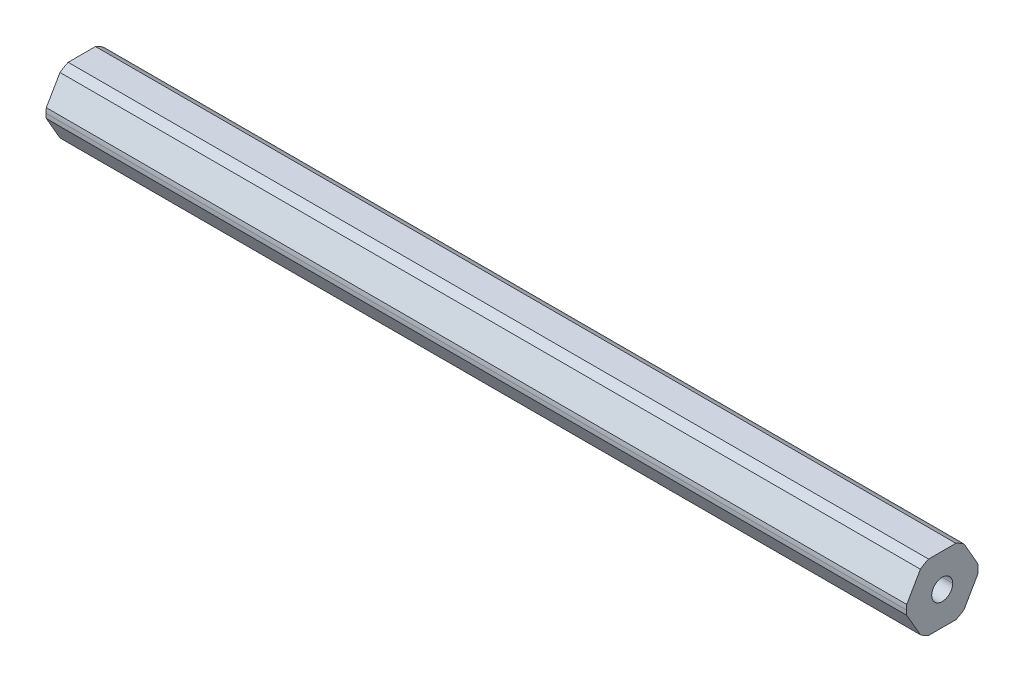
ISO-10303-21;
HEADER;
FILE_DESCRIPTION(('STEP AP214'),'2;1');
FILE_NAME('part.step','',(''),(''),'','','');
FILE_SCHEMA(('AUTOMOTIVE_DESIGN { 1 0 10303 214 1 1 1 1 }'));
ENDSEC;
DATA;
#1=APPLICATION_CONTEXT('core data for automotive mechanical design processes');
#2=APPLICATION_PROTOCOL_DEFINITION('international standard','automotive_design',2000,#1);
#3=PRODUCT_CONTEXT('',#1,'mechanical');
#4=PRODUCT('Part','Part','',(#3));
#5=PRODUCT_RELATED_PRODUCT_CATEGORY('part','',(#4));
#6=PRODUCT_DEFINITION_FORMATION('','',#4);
#7=PRODUCT_DEFINITION_CONTEXT('part definition',#1,'design');
#8=PRODUCT_DEFINITION('design','',#6,#7);
#9=PRODUCT_DEFINITION_SHAPE('','',#8);
#10=(LENGTH_UNIT() NAMED_UNIT(*) SI_UNIT(.MILLI.,.METRE.));
#11=(NAMED_UNIT(*) PLANE_ANGLE_UNIT() SI_UNIT($,.RADIAN.));
#12=(NAMED_UNIT(*) SI_UNIT($,.STERADIAN.) SOLID_ANGLE_UNIT());
#13=UNCERTAINTY_MEASURE_WITH_UNIT(LENGTH_MEASURE(1.E-05),#10,'distance_accuracy_value','');
#14=(GEOMETRIC_REPRESENTATION_CONTEXT(3) GLOBAL_UNCERTAINTY_ASSIGNED_CONTEXT((#13)) GLOBAL_UNIT_ASSIGNED_CONTEXT((#10,
#11,#12)) REPRESENTATION_CONTEXT('',''));
#15=CARTESIAN_POINT('',(0.,0.,0.));
#16=DIRECTION('',(0.,0.,1.));
#17=DIRECTION('',(1.,0.,0.));
#18=AXIS2_PLACEMENT_3D('',#15,#16,#17);
#19=CARTESIAN_POINT('',(457.2,0.,0.));
#20=DIRECTION('',(-1.,0.,0.));
#21=DIRECTION('',(0.,0.,1.));
#22=AXIS2_PLACEMENT_3D('',#19,#20,#21);
#23=CYLINDRICAL_SURFACE('',#22,6.87);
#24=DIRECTION('',(-1.,0.,0.));
#25=VECTOR('',#24,1.);
#26=CARTESIAN_POINT('',(457.2,0.90436132332773,-6.8102151652403));
#27=LINE('',#26,#25);
#28=CARTESIAN_POINT('',(-292.1,0.904361323327732,-6.8102151652403));
#29=VERTEX_POINT('',#28);
#30=CARTESIAN_POINT('',(-457.2,0.90436132332773,-6.8102151652403));
#31=VERTEX_POINT('',#30);
#32=EDGE_CURVE('E187',#29,#31,#27,.T.);
#33=ORIENTED_EDGE('',*,*,#32,.F.);
#34=CARTESIAN_POINT('',(-292.1,0.,0.));
#35=DIRECTION('',(1.,0.,0.));
#36=DIRECTION('',(0.,0.,-1.));
#37=AXIS2_PLACEMENT_3D('',#34,#35,#36);
#38=CIRCLE('',#37,6.87);
#39=CARTESIAN_POINT('',(-292.1,-0.904361323327721,-6.8102151652403));
#40=VERTEX_POINT('',#39);
#41=EDGE_CURVE('E172',#40,#29,#38,.T.);
#42=ORIENTED_EDGE('',*,*,#41,.F.);
#43=DIRECTION('',(-1.,0.,0.));
#44=VECTOR('',#43,1.);
#45=CARTESIAN_POINT('',(457.2,-0.904361323327717,-6.8102151652403));
#46=LINE('',#45,#44);
#47=CARTESIAN_POINT('',(-457.2,-0.904361323327717,-6.8102151652403));
#48=VERTEX_POINT('',#47);
#49=EDGE_CURVE('E255',#40,#48,#46,.T.);
#50=ORIENTED_EDGE('',*,*,#49,.T.);
#51=CARTESIAN_POINT('',(-457.2,0.,0.));
#52=DIRECTION('',(1.,0.,0.));
#53=DIRECTION('',(0.,0.,-1.));
#54=AXIS2_PLACEMENT_3D('',#51,#52,#53);
#55=CIRCLE('',#54,6.87);
#56=EDGE_CURVE('E61',#48,#31,#55,.T.);
#57=ORIENTED_EDGE('',*,*,#56,.T.);
#58=EDGE_LOOP('',(#33,#42,#50,#57));
#59=FACE_BOUND('',#58,.T.);
#60=ADVANCED_FACE('F52',(#59),#23,.T.);
#61=CARTESIAN_POINT('',(457.2,0.,0.));
#62=DIRECTION('',(-1.,0.,0.));
#63=DIRECTION('',(0.,0.,1.));
#64=AXIS2_PLACEMENT_3D('',#61,#62,#63);
#65=CYLINDRICAL_SURFACE('',#64,2.0193);
#66=CARTESIAN_POINT('',(-292.1,0.,0.));
#67=DIRECTION('',(1.,0.,0.));
#68=DIRECTION('',(0.,0.,-1.));
#69=AXIS2_PLACEMENT_3D('',#66,#67,#68);
#70=CIRCLE('',#69,2.0193);
#71=CARTESIAN_POINT('',(-292.1,0.,2.0193));
#72=VERTEX_POINT('',#71);
#73=CARTESIAN_POINT('',(-292.1,0.,-2.0193));
#74=VERTEX_POINT('',#73);
#75=EDGE_CURVE('E74',#72,#74,#70,.F.);
#76=ORIENTED_EDGE('',*,*,#75,.F.);
#77=DIRECTION('',(-1.,0.,0.));
#78=VECTOR('',#77,1.);
#79=CARTESIAN_POINT('',(457.2,0.,2.0193));
#80=LINE('',#79,#78);
#81=CARTESIAN_POINT('',(-457.2,0.,2.0193));
#82=VERTEX_POINT('',#81);
#83=EDGE_CURVE('E222',#72,#82,#80,.T.);
#84=ORIENTED_EDGE('',*,*,#83,.T.);
#85=CARTESIAN_POINT('',(-457.2,0.,0.));
#86=DIRECTION('',(1.,0.,0.));
#87=DIRECTION('',(0.,0.,-1.));
#88=AXIS2_PLACEMENT_3D('',#85,#86,#87);
#89=CIRCLE('',#88,2.0193);
#90=CARTESIAN_POINT('',(-457.2,0.,-2.0193));
#91=VERTEX_POINT('',#90);
#92=EDGE_CURVE('E207',#91,#82,#89,.T.);
#93=ORIENTED_EDGE('',*,*,#92,.F.);
#94=DIRECTION('',(-1.,0.,0.));
#95=VECTOR('',#94,1.);
#96=CARTESIAN_POINT('',(457.2,0.,-2.0193));
#97=LINE('',#96,#95);
#98=EDGE_CURVE('E235',#74,#91,#97,.T.);
#99=ORIENTED_EDGE('',*,*,#98,.F.);
#100=EDGE_LOOP('',(#76,#84,#93,#99));
#101=FACE_BOUND('',#100,.T.);
#102=ADVANCED_FACE('F437',(#101),#65,.F.);
#103=CARTESIAN_POINT('',(457.2,-3.175,-5.49926131403119));
#104=DIRECTION('',(0.,0.5,0.866025403784439));
#105=DIRECTION('',(1.,0.,0.));
#106=AXIS2_PLACEMENT_3D('',#103,#104,#105);
#107=PLANE('',#106);
#108=DIRECTION('',(0.,0.866025403784439,-0.5));
#109=VECTOR('',#108,1.);
#110=CARTESIAN_POINT('',(-292.1,-5.44563867667227,-4.18830746282207));
#111=LINE('',#110,#109);
#112=CARTESIAN_POINT('',(-292.1,-5.44563867667227,-4.18830746282207));
#113=VERTEX_POINT('',#112);
#114=EDGE_CURVE('E178',#113,#40,#111,.T.);
#115=ORIENTED_EDGE('',*,*,#114,.F.);
#116=DIRECTION('',(-1.,0.,0.));
#117=VECTOR('',#116,1.);
#118=CARTESIAN_POINT('',(457.2,-5.44563867667227,-4.18830746282208));
#119=LINE('',#118,#117);
#120=CARTESIAN_POINT('',(-457.2,-5.44563867667227,-4.18830746282208));
#121=VERTEX_POINT('',#120);
#122=EDGE_CURVE('E242',#113,#121,#119,.T.);
#123=ORIENTED_EDGE('',*,*,#122,.T.);
#124=DIRECTION('',(0.,0.866025403784439,-0.5));
#125=VECTOR('',#124,1.);
#126=CARTESIAN_POINT('',(-457.2,-3.175,-5.49926131403119));
#127=LINE('',#126,#125);
#128=EDGE_CURVE('E245',#121,#48,#127,.T.);
#129=ORIENTED_EDGE('',*,*,#128,.T.);
#130=ORIENTED_EDGE('',*,*,#49,.F.);
#131=EDGE_LOOP('',(#115,#123,#129,#130));
#132=FACE_BOUND('',#131,.T.);
#133=ADVANCED_FACE('F447',(#132),#107,.F.);
#134=CARTESIAN_POINT('',(457.2,0.,0.));
#135=DIRECTION('',(-1.,0.,0.));
#136=DIRECTION('',(0.,0.,1.));
#137=AXIS2_PLACEMENT_3D('',#134,#135,#136);
#138=CYLINDRICAL_SURFACE('',#137,6.87);
#139=ORIENTED_EDGE('',*,*,#122,.F.);
#140=CARTESIAN_POINT('',(-292.1,0.,0.));
#141=DIRECTION('',(1.,0.,0.));
#142=DIRECTION('',(0.,0.,-1.));
#143=AXIS2_PLACEMENT_3D('',#140,#141,#142);
#144=CIRCLE('',#143,6.87);
#145=CARTESIAN_POINT('',(-292.1,-6.35,-2.62190770241822));
#146=VERTEX_POINT('',#145);
#147=EDGE_CURVE('E372',#146,#113,#144,.T.);
#148=ORIENTED_EDGE('',*,*,#147,.F.);
#149=DIRECTION('',(-1.,0.,0.));
#150=VECTOR('',#149,1.);
#151=CARTESIAN_POINT('',(457.2,-6.35,-2.62190770241822));
#152=LINE('',#151,#150);
#153=CARTESIAN_POINT('',(-457.2,-6.35,-2.62190770241822));
#154=VERTEX_POINT('',#153);
#155=EDGE_CURVE('E230',#146,#154,#152,.T.);
#156=ORIENTED_EDGE('',*,*,#155,.T.);
#157=CARTESIAN_POINT('',(-457.2,0.,0.));
#158=DIRECTION('',(1.,0.,0.));
#159=DIRECTION('',(0.,0.,-1.));
#160=AXIS2_PLACEMENT_3D('',#157,#158,#159);
#161=CIRCLE('',#160,6.87);
#162=EDGE_CURVE('E233',#154,#121,#161,.T.);
#163=ORIENTED_EDGE('',*,*,#162,.T.);
#164=EDGE_LOOP('',(#139,#148,#156,#163));
#165=FACE_BOUND('',#164,.T.);
#166=ADVANCED_FACE('F309',(#165),#138,.T.);
#167=CARTESIAN_POINT('',(457.2,-6.35,0.));
#168=DIRECTION('',(0.,1.,0.));
#169=DIRECTION('',(0.,0.,-1.));
#170=AXIS2_PLACEMENT_3D('',#167,#168,#169);
#171=PLANE('',#170);
#172=DIRECTION('',(0.,0.,-1.));
#173=VECTOR('',#172,1.);
#174=CARTESIAN_POINT('',(-292.1,-6.35,2.62190770241822));
#175=LINE('',#174,#173);
#176=CARTESIAN_POINT('',(-292.1,-6.35,2.62190770241822));
#177=VERTEX_POINT('',#176);
#178=EDGE_CURVE('E321',#177,#146,#175,.T.);
#179=ORIENTED_EDGE('',*,*,#178,.F.);
#180=DIRECTION('',(-1.,0.,0.));
#181=VECTOR('',#180,1.);
#182=CARTESIAN_POINT('',(457.2,-6.35,2.62190770241822));
#183=LINE('',#182,#181);
#184=CARTESIAN_POINT('',(-457.2,-6.35,2.62190770241822));
#185=VERTEX_POINT('',#184);
#186=EDGE_CURVE('E212',#177,#185,#183,.T.);
#187=ORIENTED_EDGE('',*,*,#186,.T.);
#188=DIRECTION('',(0.,0.,-1.));
#189=VECTOR('',#188,1.);
#190=CARTESIAN_POINT('',(-457.2,-6.35,0.));
#191=LINE('',#190,#189);
#192=EDGE_CURVE('E234',#185,#154,#191,.T.);
#193=ORIENTED_EDGE('',*,*,#192,.T.);
#194=ORIENTED_EDGE('',*,*,#155,.F.);
#195=EDGE_LOOP('',(#179,#187,#193,#194));
#196=FACE_BOUND('',#195,.T.);
#197=ADVANCED_FACE('F319',(#196),#171,.F.);
#198=CARTESIAN_POINT('',(457.2,0.,0.));
#199=DIRECTION('',(-1.,0.,0.));
#200=DIRECTION('',(0.,0.,1.));
#201=AXIS2_PLACEMENT_3D('',#198,#199,#200);
#202=CYLINDRICAL_SURFACE('',#201,6.87);
#203=ORIENTED_EDGE('',*,*,#186,.F.);
#204=CARTESIAN_POINT('',(-292.1,0.,0.));
#205=DIRECTION('',(1.,0.,0.));
#206=DIRECTION('',(0.,0.,-1.));
#207=AXIS2_PLACEMENT_3D('',#204,#205,#206);
#208=CIRCLE('',#207,6.87);
#209=CARTESIAN_POINT('',(-292.1,-5.44563867667228,4.18830746282207));
#210=VERTEX_POINT('',#209);
#211=EDGE_CURVE('E325',#210,#177,#208,.T.);
#212=ORIENTED_EDGE('',*,*,#211,.F.);
#213=DIRECTION('',(-1.,0.,0.));
#214=VECTOR('',#213,1.);
#215=CARTESIAN_POINT('',(457.2,-5.44563867667228,4.18830746282207));
#216=LINE('',#215,#214);
#217=CARTESIAN_POINT('',(-457.2,-5.44563867667228,4.18830746282207));
#218=VERTEX_POINT('',#217);
#219=EDGE_CURVE('E213',#210,#218,#216,.T.);
#220=ORIENTED_EDGE('',*,*,#219,.T.);
#221=CARTESIAN_POINT('',(-457.2,0.,0.));
#222=DIRECTION('',(1.,0.,0.));
#223=DIRECTION('',(0.,0.,-1.));
#224=AXIS2_PLACEMENT_3D('',#221,#222,#223);
#225=CIRCLE('',#224,6.87);
#226=EDGE_CURVE('E208',#218,#185,#225,.T.);
#227=ORIENTED_EDGE('',*,*,#226,.T.);
#228=EDGE_LOOP('',(#203,#212,#220,#227));
#229=FACE_BOUND('',#228,.T.);
#230=ADVANCED_FACE('F324',(#229),#202,.T.);
#231=CARTESIAN_POINT('',(457.2,-3.175,5.49926131403118));
#232=DIRECTION('',(0.,0.5,-0.866025403784439));
#233=DIRECTION('',(-1.,0.,0.));
#234=AXIS2_PLACEMENT_3D('',#231,#232,#233);
#235=PLANE('',#234);
#236=DIRECTION('',(0.,-0.866025403784439,-0.499999999999999));
#237=VECTOR('',#236,1.);
#238=CARTESIAN_POINT('',(-292.1,-0.904361323327719,6.8102151652403));
#239=LINE('',#238,#237);
#240=CARTESIAN_POINT('',(-292.1,-0.904361323327719,6.8102151652403));
#241=VERTEX_POINT('',#240);
#242=EDGE_CURVE('E331',#241,#210,#239,.T.);
#243=ORIENTED_EDGE('',*,*,#242,.F.);
#244=DIRECTION('',(-1.,0.,0.));
#245=VECTOR('',#244,1.);
#246=CARTESIAN_POINT('',(457.2,-0.904361323327726,6.8102151652403));
#247=LINE('',#246,#245);
#248=CARTESIAN_POINT('',(-457.2,-0.904361323327726,6.8102151652403));
#249=VERTEX_POINT('',#248);
#250=EDGE_CURVE('E259',#241,#249,#247,.T.);
#251=ORIENTED_EDGE('',*,*,#250,.T.);
#252=DIRECTION('',(0.,-0.866025403784438,-0.5));
#253=VECTOR('',#252,1.);
#254=CARTESIAN_POINT('',(-457.2,-3.175,5.49926131403118));
#255=LINE('',#254,#253);
#256=EDGE_CURVE('E229',#249,#218,#255,.T.);
#257=ORIENTED_EDGE('',*,*,#256,.T.);
#258=ORIENTED_EDGE('',*,*,#219,.F.);
#259=EDGE_LOOP('',(#243,#251,#257,#258));
#260=FACE_BOUND('',#259,.T.);
#261=ADVANCED_FACE('F330',(#260),#235,.F.);
#262=CARTESIAN_POINT('',(457.2,0.,0.));
#263=DIRECTION('',(-1.,0.,0.));
#264=DIRECTION('',(0.,0.,1.));
#265=AXIS2_PLACEMENT_3D('',#262,#263,#264);
#266=CYLINDRICAL_SURFACE('',#265,6.87);
#267=DIRECTION('',(-1.,0.,0.));
#268=VECTOR('',#267,1.);
#269=CARTESIAN_POINT('',(457.2,0.,6.87));
#270=LINE('',#269,#268);
#271=CARTESIAN_POINT('',(-292.1,0.,6.87));
#272=VERTEX_POINT('',#271);
#273=CARTESIAN_POINT('',(-457.2,0.,6.87));
#274=VERTEX_POINT('',#273);
#275=EDGE_CURVE('E225',#272,#274,#270,.T.);
#276=ORIENTED_EDGE('',*,*,#275,.F.);
#277=CARTESIAN_POINT('',(-292.1,0.,0.));
#278=DIRECTION('',(1.,0.,0.));
#279=DIRECTION('',(0.,0.,-1.));
#280=AXIS2_PLACEMENT_3D('',#277,#278,#279);
#281=CIRCLE('',#280,6.87);
#282=CARTESIAN_POINT('',(-292.1,0.904361323327723,6.8102151652403));
#283=VERTEX_POINT('',#282);
#284=EDGE_CURVE('E68',#283,#272,#281,.T.);
#285=ORIENTED_EDGE('',*,*,#284,.F.);
#286=DIRECTION('',(-1.,0.,0.));
#287=VECTOR('',#286,1.);
#288=CARTESIAN_POINT('',(457.2,0.904361323327724,6.8102151652403));
#289=LINE('',#288,#287);
#290=CARTESIAN_POINT('',(-457.2,0.904361323327724,6.8102151652403));
#291=VERTEX_POINT('',#290);
#292=EDGE_CURVE('E220',#283,#291,#289,.T.);
#293=ORIENTED_EDGE('',*,*,#292,.T.);
#294=CARTESIAN_POINT('',(-457.2,0.,0.));
#295=DIRECTION('',(1.,0.,0.));
#296=DIRECTION('',(0.,0.,-1.));
#297=AXIS2_PLACEMENT_3D('',#294,#295,#296);
#298=CIRCLE('',#297,6.87);
#299=EDGE_CURVE('E238',#291,#274,#298,.T.);
#300=ORIENTED_EDGE('',*,*,#299,.T.);
#301=EDGE_LOOP('',(#276,#285,#293,#300));
#302=FACE_BOUND('',#301,.T.);
#303=ADVANCED_FACE('F338',(#302),#266,.T.);
#304=CARTESIAN_POINT('',(457.2,3.175,5.49926131403119));
#305=DIRECTION('',(0.,-0.5,-0.866025403784439));
#306=DIRECTION('',(0.,-0.866025403784439,0.5));
#307=AXIS2_PLACEMENT_3D('',#304,#305,#306);
#308=PLANE('',#307);
#309=DIRECTION('',(0.,-0.866025403784439,0.499999999999999));
#310=VECTOR('',#309,1.);
#311=CARTESIAN_POINT('',(-292.1,5.44563867667227,4.18830746282208));
#312=LINE('',#311,#310);
#313=CARTESIAN_POINT('',(-292.1,5.44563867667227,4.18830746282208));
#314=VERTEX_POINT('',#313);
#315=EDGE_CURVE('E335',#314,#283,#312,.T.);
#316=ORIENTED_EDGE('',*,*,#315,.F.);
#317=DIRECTION('',(-1.,0.,0.));
#318=VECTOR('',#317,1.);
#319=CARTESIAN_POINT('',(457.2,5.44563867667227,4.18830746282208));
#320=LINE('',#319,#318);
#321=CARTESIAN_POINT('',(-457.2,5.44563867667227,4.18830746282208));
#322=VERTEX_POINT('',#321);
#323=EDGE_CURVE('E221',#314,#322,#320,.T.);
#324=ORIENTED_EDGE('',*,*,#323,.T.);
#325=DIRECTION('',(0.,-0.866025403784439,0.5));
#326=VECTOR('',#325,1.);
#327=CARTESIAN_POINT('',(-457.2,3.175,5.49926131403119));
#328=LINE('',#327,#326);
#329=EDGE_CURVE('E216',#322,#291,#328,.T.);
#330=ORIENTED_EDGE('',*,*,#329,.T.);
#331=ORIENTED_EDGE('',*,*,#292,.F.);
#332=EDGE_LOOP('',(#316,#324,#330,#331));
#333=FACE_BOUND('',#332,.T.);
#334=ADVANCED_FACE('F344',(#333),#308,.F.);
#335=CARTESIAN_POINT('',(457.2,0.,0.));
#336=DIRECTION('',(-1.,0.,0.));
#337=DIRECTION('',(0.,0.,1.));
#338=AXIS2_PLACEMENT_3D('',#335,#336,#337);
#339=CYLINDRICAL_SURFACE('',#338,6.87);
#340=ORIENTED_EDGE('',*,*,#323,.F.);
#341=CARTESIAN_POINT('',(-292.1,0.,0.));
#342=DIRECTION('',(1.,0.,0.));
#343=DIRECTION('',(0.,0.,-1.));
#344=AXIS2_PLACEMENT_3D('',#341,#342,#343);
#345=CIRCLE('',#344,6.87);
#346=CARTESIAN_POINT('',(-292.1,6.35,2.62190770241823));
#347=VERTEX_POINT('',#346);
#348=EDGE_CURVE('E346',#347,#314,#345,.T.);
#349=ORIENTED_EDGE('',*,*,#348,.F.);
#350=DIRECTION('',(-1.,0.,0.));
#351=VECTOR('',#350,1.);
#352=CARTESIAN_POINT('',(457.2,6.35,2.62190770241822));
#353=LINE('',#352,#351);
#354=CARTESIAN_POINT('',(-457.2,6.35,2.62190770241822));
#355=VERTEX_POINT('',#354);
#356=EDGE_CURVE('E252',#347,#355,#353,.T.);
#357=ORIENTED_EDGE('',*,*,#356,.T.);
#358=CARTESIAN_POINT('',(-457.2,0.,0.));
#359=DIRECTION('',(1.,0.,0.));
#360=DIRECTION('',(0.,0.,-1.));
#361=AXIS2_PLACEMENT_3D('',#358,#359,#360);
#362=CIRCLE('',#361,6.87);
#363=EDGE_CURVE('E260',#355,#322,#362,.T.);
#364=ORIENTED_EDGE('',*,*,#363,.T.);
#365=EDGE_LOOP('',(#340,#349,#357,#364));
#366=FACE_BOUND('',#365,.T.);
#367=ADVANCED_FACE('F345',(#366),#339,.T.);
#368=CARTESIAN_POINT('',(457.2,6.35,0.));
#369=DIRECTION('',(0.,-1.,0.));
#370=DIRECTION('',(0.,0.,-1.));
#371=AXIS2_PLACEMENT_3D('',#368,#369,#370);
#372=PLANE('',#371);
#373=DIRECTION('',(0.,0.,1.));
#374=VECTOR('',#373,1.);
#375=CARTESIAN_POINT('',(-292.1,6.35,-2.62190770241822));
#376=LINE('',#375,#374);
#377=CARTESIAN_POINT('',(-292.1,6.35,-2.62190770241822));
#378=VERTEX_POINT('',#377);
#379=EDGE_CURVE('E348',#378,#347,#376,.T.);
#380=ORIENTED_EDGE('',*,*,#379,.F.);
#381=DIRECTION('',(-1.,0.,0.));
#382=VECTOR('',#381,1.);
#383=CARTESIAN_POINT('',(457.2,6.35,-2.62190770241822));
#384=LINE('',#383,#382);
#385=CARTESIAN_POINT('',(-457.2,6.35,-2.62190770241822));
#386=VERTEX_POINT('',#385);
#387=EDGE_CURVE('E201',#378,#386,#384,.T.);
#388=ORIENTED_EDGE('',*,*,#387,.T.);
#389=DIRECTION('',(0.,0.,1.));
#390=VECTOR('',#389,1.);
#391=CARTESIAN_POINT('',(-457.2,6.35,0.));
#392=LINE('',#391,#390);
#393=EDGE_CURVE('E248',#386,#355,#392,.T.);
#394=ORIENTED_EDGE('',*,*,#393,.T.);
#395=ORIENTED_EDGE('',*,*,#356,.F.);
#396=EDGE_LOOP('',(#380,#388,#394,#395));
#397=FACE_BOUND('',#396,.T.);
#398=ADVANCED_FACE('F352',(#397),#372,.F.);
#399=CARTESIAN_POINT('',(457.2,0.,0.));
#400=DIRECTION('',(-1.,0.,0.));
#401=DIRECTION('',(0.,0.,1.));
#402=AXIS2_PLACEMENT_3D('',#399,#400,#401);
#403=CYLINDRICAL_SURFACE('',#402,6.87);
#404=ORIENTED_EDGE('',*,*,#387,.F.);
#405=CARTESIAN_POINT('',(-292.1,0.,0.));
#406=DIRECTION('',(1.,0.,0.));
#407=DIRECTION('',(0.,0.,-1.));
#408=AXIS2_PLACEMENT_3D('',#405,#406,#407);
#409=CIRCLE('',#408,6.87);
#410=CARTESIAN_POINT('',(-292.1,5.44563867667227,-4.18830746282207));
#411=VERTEX_POINT('',#410);
#412=EDGE_CURVE('E191',#411,#378,#409,.T.);
#413=ORIENTED_EDGE('',*,*,#412,.F.);
#414=DIRECTION('',(-1.,0.,0.));
#415=VECTOR('',#414,1.);
#416=CARTESIAN_POINT('',(457.2,5.44563867667227,-4.18830746282208));
#417=LINE('',#416,#415);
#418=CARTESIAN_POINT('',(-457.2,5.44563867667227,-4.18830746282208));
#419=VERTEX_POINT('',#418);
#420=EDGE_CURVE('E189',#411,#419,#417,.T.);
#421=ORIENTED_EDGE('',*,*,#420,.T.);
#422=CARTESIAN_POINT('',(-457.2,0.,0.));
#423=DIRECTION('',(1.,0.,0.));
#424=DIRECTION('',(0.,0.,-1.));
#425=AXIS2_PLACEMENT_3D('',#422,#423,#424);
#426=CIRCLE('',#425,6.87);
#427=EDGE_CURVE('E196',#419,#386,#426,.T.);
#428=ORIENTED_EDGE('',*,*,#427,.T.);
#429=EDGE_LOOP('',(#404,#413,#421,#428));
#430=FACE_BOUND('',#429,.T.);
#431=ADVANCED_FACE('F357',(#430),#403,.T.);
#432=CARTESIAN_POINT('',(457.2,3.175,-5.49926131403119));
#433=DIRECTION('',(0.,-0.5,0.866025403784439));
#434=DIRECTION('',(-1.,0.,0.));
#435=AXIS2_PLACEMENT_3D('',#432,#433,#434);
#436=PLANE('',#435);
#437=DIRECTION('',(0.,0.866025403784438,0.500000000000001));
#438=VECTOR('',#437,1.);
#439=CARTESIAN_POINT('',(-292.1,0.904361323327732,-6.8102151652403));
#440=LINE('',#439,#438);
#441=EDGE_CURVE('E175',#29,#411,#440,.T.);
#442=ORIENTED_EDGE('',*,*,#441,.F.);
#443=ORIENTED_EDGE('',*,*,#32,.T.);
#444=DIRECTION('',(0.,0.866025403784439,0.5));
#445=VECTOR('',#444,1.);
#446=CARTESIAN_POINT('',(-457.2,3.175,-5.49926131403119));
#447=LINE('',#446,#445);
#448=EDGE_CURVE('E203',#31,#419,#447,.T.);
#449=ORIENTED_EDGE('',*,*,#448,.T.);
#450=ORIENTED_EDGE('',*,*,#420,.F.);
#451=EDGE_LOOP('',(#442,#443,#449,#450));
#452=FACE_BOUND('',#451,.T.);
#453=ADVANCED_FACE('F54',(#452),#436,.F.);
#454=CARTESIAN_POINT('',(457.2,0.,0.));
#455=DIRECTION('',(-1.,0.,0.));
#456=DIRECTION('',(0.,0.,1.));
#457=AXIS2_PLACEMENT_3D('',#454,#455,#456);
#458=CYLINDRICAL_SURFACE('',#457,6.87);
#459=ORIENTED_EDGE('',*,*,#250,.F.);
#460=EDGE_CURVE('E333',#272,#241,#281,.T.);
#461=ORIENTED_EDGE('',*,*,#460,.F.);
#462=ORIENTED_EDGE('',*,*,#275,.T.);
#463=CARTESIAN_POINT('',(-457.2,0.,0.));
#464=DIRECTION('',(1.,0.,0.));
#465=DIRECTION('',(0.,0.,-1.));
#466=AXIS2_PLACEMENT_3D('',#463,#464,#465);
#467=CIRCLE('',#466,6.87);
#468=EDGE_CURVE('E282',#274,#249,#467,.T.);
#469=ORIENTED_EDGE('',*,*,#468,.T.);
#470=EDGE_LOOP('',(#459,#461,#462,#469));
#471=FACE_BOUND('',#470,.T.);
#472=ADVANCED_FACE('F332',(#471),#458,.T.);
#473=CARTESIAN_POINT('',(457.2,0.,0.));
#474=DIRECTION('',(-1.,0.,0.));
#475=DIRECTION('',(0.,0.,1.));
#476=AXIS2_PLACEMENT_3D('',#473,#474,#475);
#477=CYLINDRICAL_SURFACE('',#476,2.0193);
#478=CARTESIAN_POINT('',(-292.1,0.,0.));
#479=DIRECTION('',(1.,0.,0.));
#480=DIRECTION('',(0.,0.,-1.));
#481=AXIS2_PLACEMENT_3D('',#478,#479,#480);
#482=CIRCLE('',#481,2.0193);
#483=EDGE_CURVE('E11',#74,#72,#482,.F.);
#484=ORIENTED_EDGE('',*,*,#483,.F.);
#485=ORIENTED_EDGE('',*,*,#98,.T.);
#486=CARTESIAN_POINT('',(-457.2,0.,0.));
#487=DIRECTION('',(1.,0.,0.));
#488=DIRECTION('',(0.,0.,-1.));
#489=AXIS2_PLACEMENT_3D('',#486,#487,#488);
#490=CIRCLE('',#489,2.0193);
#491=EDGE_CURVE('E226',#82,#91,#490,.T.);
#492=ORIENTED_EDGE('',*,*,#491,.F.);
#493=ORIENTED_EDGE('',*,*,#83,.F.);
#494=EDGE_LOOP('',(#484,#485,#492,#493));
#495=FACE_BOUND('',#494,.T.);
#496=ADVANCED_FACE('F409',(#495),#477,.F.);
#497=CARTESIAN_POINT('',(-457.2,0.,0.));
#498=DIRECTION('',(1.,0.,0.));
#499=DIRECTION('',(0.,1.,0.));
#500=AXIS2_PLACEMENT_3D('',#497,#498,#499);
#501=PLANE('',#500);
#502=ORIENTED_EDGE('',*,*,#491,.T.);
#503=ORIENTED_EDGE('',*,*,#92,.T.);
#504=EDGE_LOOP('',(#502,#503));
#505=FACE_BOUND('',#504,.T.);
#506=ORIENTED_EDGE('',*,*,#448,.F.);
#507=ORIENTED_EDGE('',*,*,#56,.F.);
#508=ORIENTED_EDGE('',*,*,#128,.F.);
#509=ORIENTED_EDGE('',*,*,#162,.F.);
#510=ORIENTED_EDGE('',*,*,#192,.F.);
#511=ORIENTED_EDGE('',*,*,#226,.F.);
#512=ORIENTED_EDGE('',*,*,#256,.F.);
#513=ORIENTED_EDGE('',*,*,#468,.F.);
#514=ORIENTED_EDGE('',*,*,#299,.F.);
#515=ORIENTED_EDGE('',*,*,#329,.F.);
#516=ORIENTED_EDGE('',*,*,#363,.F.);
#517=ORIENTED_EDGE('',*,*,#393,.F.);
#518=ORIENTED_EDGE('',*,*,#427,.F.);
#519=EDGE_LOOP('',(#506,#507,#508,#509,#510,#511,#512,#513,#514,#515,#516,#517,#518));
#520=FACE_BOUND('',#519,.T.);
#521=ADVANCED_FACE('F315',(#505,#520),#501,.F.);
#522=CARTESIAN_POINT('',(-292.1,0.,0.));
#523=DIRECTION('',(1.,0.,0.));
#524=DIRECTION('',(0.,0.,-1.));
#525=AXIS2_PLACEMENT_3D('',#522,#523,#524);
#526=PLANE('',#525);
#527=ORIENTED_EDGE('',*,*,#41,.T.);
#528=ORIENTED_EDGE('',*,*,#441,.T.);
#529=ORIENTED_EDGE('',*,*,#412,.T.);
#530=ORIENTED_EDGE('',*,*,#379,.T.);
#531=ORIENTED_EDGE('',*,*,#348,.T.);
#532=ORIENTED_EDGE('',*,*,#315,.T.);
#533=ORIENTED_EDGE('',*,*,#284,.T.);
#534=ORIENTED_EDGE('',*,*,#460,.T.);
#535=ORIENTED_EDGE('',*,*,#242,.T.);
#536=ORIENTED_EDGE('',*,*,#211,.T.);
#537=ORIENTED_EDGE('',*,*,#178,.T.);
#538=ORIENTED_EDGE('',*,*,#147,.T.);
#539=ORIENTED_EDGE('',*,*,#114,.T.);
#540=EDGE_LOOP('',(#527,#528,#529,#530,#531,#532,#533,#534,#535,#536,#537,#538,#539));
#541=FACE_BOUND('',#540,.T.);
#542=ORIENTED_EDGE('',*,*,#75,.T.);
#543=ORIENTED_EDGE('',*,*,#483,.T.);
#544=EDGE_LOOP('',(#542,#543));
#545=FACE_BOUND('',#544,.T.);
#546=ADVANCED_FACE('F174',(#541,#545),#526,.T.);
#547=CLOSED_SHELL('',(#60,#102,#133,#166,#197,#230,#261,#303,#334,#367,#398,#431,#453,#472,#496,
#521,#546));
#548=MANIFOLD_SOLID_BREP('B2',#547);
#549=ADVANCED_BREP_SHAPE_REPRESENTATION('',(#18,#548),#14);
#550=SHAPE_DEFINITION_REPRESENTATION(#9,#549);
ENDSEC;
END-ISO-10303-21;
